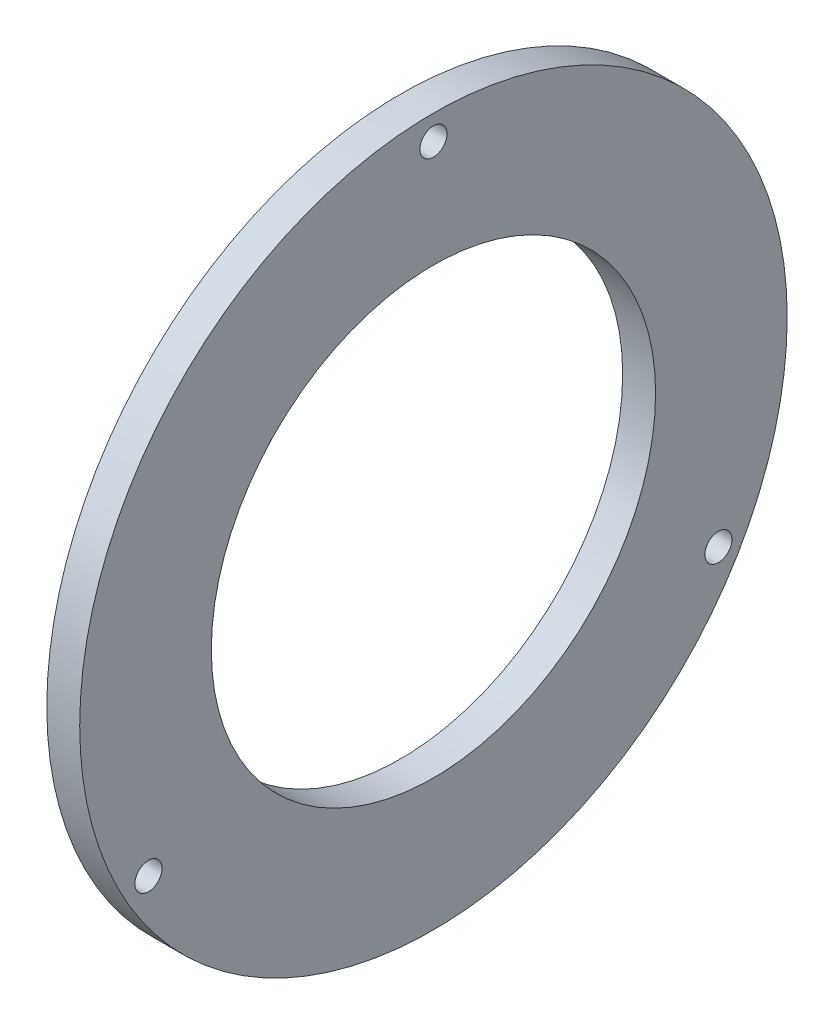
ISO-10303-21;
HEADER;
FILE_DESCRIPTION(('STEP AP214'),'2;1');
FILE_NAME('part.step','',(''),(''),'','','');
FILE_SCHEMA(('AUTOMOTIVE_DESIGN { 1 0 10303 214 1 1 1 1 }'));
ENDSEC;
DATA;
#1=APPLICATION_CONTEXT('core data for automotive mechanical design processes');
#2=APPLICATION_PROTOCOL_DEFINITION('international standard','automotive_design',2000,#1);
#3=PRODUCT_CONTEXT('',#1,'mechanical');
#4=PRODUCT('Part','Part','',(#3));
#5=PRODUCT_RELATED_PRODUCT_CATEGORY('part','',(#4));
#6=PRODUCT_DEFINITION_FORMATION('','',#4);
#7=PRODUCT_DEFINITION_CONTEXT('part definition',#1,'design');
#8=PRODUCT_DEFINITION('design','',#6,#7);
#9=PRODUCT_DEFINITION_SHAPE('','',#8);
#10=(LENGTH_UNIT() NAMED_UNIT(*) SI_UNIT(.MILLI.,.METRE.));
#11=(NAMED_UNIT(*) PLANE_ANGLE_UNIT() SI_UNIT($,.RADIAN.));
#12=(NAMED_UNIT(*) SI_UNIT($,.STERADIAN.) SOLID_ANGLE_UNIT());
#13=UNCERTAINTY_MEASURE_WITH_UNIT(LENGTH_MEASURE(1.E-05),#10,'distance_accuracy_value','');
#14=(GEOMETRIC_REPRESENTATION_CONTEXT(3) GLOBAL_UNCERTAINTY_ASSIGNED_CONTEXT((#13)) GLOBAL_UNIT_ASSIGNED_CONTEXT((#10,
#11,#12)) REPRESENTATION_CONTEXT('',''));
#15=CARTESIAN_POINT('',(0.,0.,0.));
#16=DIRECTION('',(0.,0.,1.));
#17=DIRECTION('',(1.,0.,0.));
#18=AXIS2_PLACEMENT_3D('',#15,#16,#17);
#19=CARTESIAN_POINT('',(131.7,43.,0.));
#20=DIRECTION('',(1.,0.,0.));
#21=DIRECTION('',(0.,0.,-1.));
#22=AXIS2_PLACEMENT_3D('',#19,#20,#21);
#23=PLANE('',#22);
#24=CARTESIAN_POINT('',(131.7,40.,0.));
#25=DIRECTION('',(1.,0.,0.));
#26=DIRECTION('',(0.,0.,-1.));
#27=AXIS2_PLACEMENT_3D('',#24,#25,#26);
#28=CIRCLE('',#27,1.65);
#29=CARTESIAN_POINT('',(131.7,40.,-1.65));
#30=VERTEX_POINT('',#29);
#31=EDGE_CURVE('E50',#30,#30,#28,.F.);
#32=ORIENTED_EDGE('',*,*,#31,.F.);
#33=EDGE_LOOP('',(#32));
#34=FACE_BOUND('',#33,.T.);
#35=CARTESIAN_POINT('',(131.7,-20.,34.6410161513775));
#36=DIRECTION('',(1.,0.,0.));
#37=DIRECTION('',(0.,0.,-1.));
#38=AXIS2_PLACEMENT_3D('',#35,#36,#37);
#39=CIRCLE('',#38,1.65);
#40=CARTESIAN_POINT('',(131.7,-20.,32.9910161513776));
#41=VERTEX_POINT('',#40);
#42=EDGE_CURVE('E53',#41,#41,#39,.F.);
#43=ORIENTED_EDGE('',*,*,#42,.F.);
#44=EDGE_LOOP('',(#43));
#45=FACE_BOUND('',#44,.T.);
#46=CARTESIAN_POINT('',(131.7,-20.,-34.6410161513775));
#47=DIRECTION('',(1.,0.,0.));
#48=DIRECTION('',(0.,0.,-1.));
#49=AXIS2_PLACEMENT_3D('',#46,#47,#48);
#50=CIRCLE('',#49,1.65);
#51=CARTESIAN_POINT('',(131.7,-20.,-36.2910161513775));
#52=VERTEX_POINT('',#51);
#53=EDGE_CURVE('E56',#52,#52,#50,.F.);
#54=ORIENTED_EDGE('',*,*,#53,.F.);
#55=EDGE_LOOP('',(#54));
#56=FACE_BOUND('',#55,.T.);
#57=CARTESIAN_POINT('',(131.7,0.,0.));
#58=DIRECTION('',(-1.,0.,0.));
#59=DIRECTION('',(0.,0.,1.));
#60=AXIS2_PLACEMENT_3D('',#57,#58,#59);
#61=CIRCLE('',#60,27.);
#62=CARTESIAN_POINT('',(131.7,0.,27.));
#63=VERTEX_POINT('',#62);
#64=EDGE_CURVE('E10',#63,#63,#61,.T.);
#65=ORIENTED_EDGE('',*,*,#64,.F.);
#66=EDGE_LOOP('',(#65));
#67=FACE_BOUND('',#66,.T.);
#68=CARTESIAN_POINT('',(131.7,0.,0.));
#69=DIRECTION('',(-1.,0.,0.));
#70=DIRECTION('',(0.,0.,1.));
#71=AXIS2_PLACEMENT_3D('',#68,#69,#70);
#72=CIRCLE('',#71,43.);
#73=CARTESIAN_POINT('',(131.7,0.,43.));
#74=VERTEX_POINT('',#73);
#75=EDGE_CURVE('E45',#74,#74,#72,.T.);
#76=ORIENTED_EDGE('',*,*,#75,.T.);
#77=EDGE_LOOP('',(#76));
#78=FACE_BOUND('',#77,.T.);
#79=ADVANCED_FACE('F31',(#34,#45,#56,#67,#78),#23,.F.);
#80=CARTESIAN_POINT('',(-110.,0.,0.));
#81=DIRECTION('',(-1.,0.,0.));
#82=DIRECTION('',(0.,0.,1.));
#83=AXIS2_PLACEMENT_3D('',#80,#81,#82);
#84=CYLINDRICAL_SURFACE('',#83,27.);
#85=CARTESIAN_POINT('',(135.7,0.,0.));
#86=DIRECTION('',(-1.,0.,0.));
#87=DIRECTION('',(0.,0.,1.));
#88=AXIS2_PLACEMENT_3D('',#85,#86,#87);
#89=CIRCLE('',#88,27.);
#90=CARTESIAN_POINT('',(135.7,0.,27.));
#91=VERTEX_POINT('',#90);
#92=EDGE_CURVE('E37',#91,#91,#89,.T.);
#93=ORIENTED_EDGE('',*,*,#92,.F.);
#94=EDGE_LOOP('',(#93));
#95=FACE_BOUND('',#94,.T.);
#96=ORIENTED_EDGE('',*,*,#64,.T.);
#97=EDGE_LOOP('',(#96));
#98=FACE_BOUND('',#97,.T.);
#99=ADVANCED_FACE('F76',(#95,#98),#84,.F.);
#100=CARTESIAN_POINT('',(135.7,27.,0.));
#101=DIRECTION('',(-1.,0.,0.));
#102=DIRECTION('',(0.,0.,1.));
#103=AXIS2_PLACEMENT_3D('',#100,#101,#102);
#104=PLANE('',#103);
#105=CARTESIAN_POINT('',(135.7,40.,0.));
#106=DIRECTION('',(1.,0.,0.));
#107=DIRECTION('',(0.,0.,-1.));
#108=AXIS2_PLACEMENT_3D('',#105,#106,#107);
#109=CIRCLE('',#108,1.65);
#110=CARTESIAN_POINT('',(135.7,40.,-1.65));
#111=VERTEX_POINT('',#110);
#112=EDGE_CURVE('E59',#111,#111,#109,.T.);
#113=ORIENTED_EDGE('',*,*,#112,.F.);
#114=EDGE_LOOP('',(#113));
#115=FACE_BOUND('',#114,.T.);
#116=CARTESIAN_POINT('',(135.7,-20.,34.6410161513775));
#117=DIRECTION('',(1.,0.,0.));
#118=DIRECTION('',(0.,0.,-1.));
#119=AXIS2_PLACEMENT_3D('',#116,#117,#118);
#120=CIRCLE('',#119,1.65);
#121=CARTESIAN_POINT('',(135.7,-20.,32.9910161513776));
#122=VERTEX_POINT('',#121);
#123=EDGE_CURVE('E63',#122,#122,#120,.T.);
#124=ORIENTED_EDGE('',*,*,#123,.F.);
#125=EDGE_LOOP('',(#124));
#126=FACE_BOUND('',#125,.T.);
#127=CARTESIAN_POINT('',(135.7,-20.,-34.6410161513775));
#128=DIRECTION('',(1.,0.,0.));
#129=DIRECTION('',(0.,0.,-1.));
#130=AXIS2_PLACEMENT_3D('',#127,#128,#129);
#131=CIRCLE('',#130,1.65);
#132=CARTESIAN_POINT('',(135.7,-20.,-36.2910161513775));
#133=VERTEX_POINT('',#132);
#134=EDGE_CURVE('E60',#133,#133,#131,.T.);
#135=ORIENTED_EDGE('',*,*,#134,.F.);
#136=EDGE_LOOP('',(#135));
#137=FACE_BOUND('',#136,.T.);
#138=CARTESIAN_POINT('',(135.7,0.,0.));
#139=DIRECTION('',(-1.,0.,0.));
#140=DIRECTION('',(0.,0.,1.));
#141=AXIS2_PLACEMENT_3D('',#138,#139,#140);
#142=CIRCLE('',#141,43.);
#143=CARTESIAN_POINT('',(135.7,0.,43.));
#144=VERTEX_POINT('',#143);
#145=EDGE_CURVE('E41',#144,#144,#142,.T.);
#146=ORIENTED_EDGE('',*,*,#145,.F.);
#147=EDGE_LOOP('',(#146));
#148=FACE_BOUND('',#147,.T.);
#149=ORIENTED_EDGE('',*,*,#92,.T.);
#150=EDGE_LOOP('',(#149));
#151=FACE_BOUND('',#150,.T.);
#152=ADVANCED_FACE('F72',(#115,#126,#137,#148,#151),#104,.F.);
#153=CARTESIAN_POINT('',(-110.,0.,0.));
#154=DIRECTION('',(-1.,0.,0.));
#155=DIRECTION('',(0.,0.,1.));
#156=AXIS2_PLACEMENT_3D('',#153,#154,#155);
#157=CYLINDRICAL_SURFACE('',#156,43.);
#158=ORIENTED_EDGE('',*,*,#75,.F.);
#159=EDGE_LOOP('',(#158));
#160=FACE_BOUND('',#159,.T.);
#161=ORIENTED_EDGE('',*,*,#145,.T.);
#162=EDGE_LOOP('',(#161));
#163=FACE_BOUND('',#162,.T.);
#164=ADVANCED_FACE('F75',(#160,#163),#157,.T.);
#165=CARTESIAN_POINT('',(131.7,-20.,-34.6410161513775));
#166=DIRECTION('',(-1.,0.,0.));
#167=DIRECTION('',(0.,0.,1.));
#168=AXIS2_PLACEMENT_3D('',#165,#166,#167);
#169=CYLINDRICAL_SURFACE('',#168,1.65);
#170=ORIENTED_EDGE('',*,*,#134,.T.);
#171=EDGE_LOOP('',(#170));
#172=FACE_BOUND('',#171,.T.);
#173=ORIENTED_EDGE('',*,*,#53,.T.);
#174=EDGE_LOOP('',(#173));
#175=FACE_BOUND('',#174,.T.);
#176=ADVANCED_FACE('F85',(#172,#175),#169,.F.);
#177=CARTESIAN_POINT('',(131.7,-20.,34.6410161513775));
#178=DIRECTION('',(-1.,0.,0.));
#179=DIRECTION('',(0.,0.,1.));
#180=AXIS2_PLACEMENT_3D('',#177,#178,#179);
#181=CYLINDRICAL_SURFACE('',#180,1.65);
#182=ORIENTED_EDGE('',*,*,#123,.T.);
#183=EDGE_LOOP('',(#182));
#184=FACE_BOUND('',#183,.T.);
#185=ORIENTED_EDGE('',*,*,#42,.T.);
#186=EDGE_LOOP('',(#185));
#187=FACE_BOUND('',#186,.T.);
#188=ADVANCED_FACE('F91',(#184,#187),#181,.F.);
#189=CARTESIAN_POINT('',(131.7,40.,0.));
#190=DIRECTION('',(-1.,0.,0.));
#191=DIRECTION('',(0.,0.,1.));
#192=AXIS2_PLACEMENT_3D('',#189,#190,#191);
#193=CYLINDRICAL_SURFACE('',#192,1.65);
#194=ORIENTED_EDGE('',*,*,#112,.T.);
#195=EDGE_LOOP('',(#194));
#196=FACE_BOUND('',#195,.T.);
#197=ORIENTED_EDGE('',*,*,#31,.T.);
#198=EDGE_LOOP('',(#197));
#199=FACE_BOUND('',#198,.T.);
#200=ADVANCED_FACE('F69',(#196,#199),#193,.F.);
#201=CLOSED_SHELL('',(#79,#99,#152,#164,#176,#188,#200));
#202=MANIFOLD_SOLID_BREP('B2',#201);
#203=ADVANCED_BREP_SHAPE_REPRESENTATION('',(#18,#202),#14);
#204=SHAPE_DEFINITION_REPRESENTATION(#9,#203);
ENDSEC;
END-ISO-10303-21;
